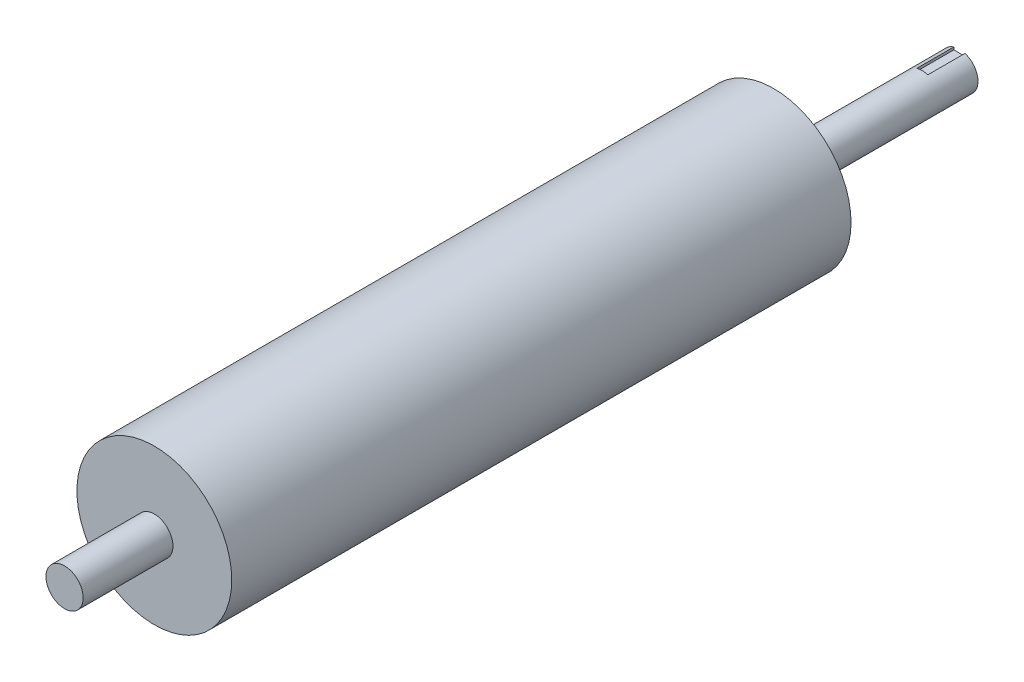
ISO-10303-21;
HEADER;
FILE_DESCRIPTION(('STEP AP214'),'2;1');
FILE_NAME('part.step','',(''),(''),'','','');
FILE_SCHEMA(('AUTOMOTIVE_DESIGN { 1 0 10303 214 1 1 1 1 }'));
ENDSEC;
DATA;
#1=APPLICATION_CONTEXT('core data for automotive mechanical design processes');
#2=APPLICATION_PROTOCOL_DEFINITION('international standard','automotive_design',2000,#1);
#3=PRODUCT_CONTEXT('',#1,'mechanical');
#4=PRODUCT('Part','Part','',(#3));
#5=PRODUCT_RELATED_PRODUCT_CATEGORY('part','',(#4));
#6=PRODUCT_DEFINITION_FORMATION('','',#4);
#7=PRODUCT_DEFINITION_CONTEXT('part definition',#1,'design');
#8=PRODUCT_DEFINITION('design','',#6,#7);
#9=PRODUCT_DEFINITION_SHAPE('','',#8);
#10=(LENGTH_UNIT() NAMED_UNIT(*) SI_UNIT(.MILLI.,.METRE.));
#11=(NAMED_UNIT(*) PLANE_ANGLE_UNIT() SI_UNIT($,.RADIAN.));
#12=(NAMED_UNIT(*) SI_UNIT($,.STERADIAN.) SOLID_ANGLE_UNIT());
#13=UNCERTAINTY_MEASURE_WITH_UNIT(LENGTH_MEASURE(1.E-05),#10,'distance_accuracy_value','');
#14=(GEOMETRIC_REPRESENTATION_CONTEXT(3) GLOBAL_UNCERTAINTY_ASSIGNED_CONTEXT((#13)) GLOBAL_UNIT_ASSIGNED_CONTEXT((#10,
#11,#12)) REPRESENTATION_CONTEXT('',''));
#15=CARTESIAN_POINT('',(0.,0.,0.));
#16=DIRECTION('',(0.,0.,1.));
#17=DIRECTION('',(1.,0.,0.));
#18=AXIS2_PLACEMENT_3D('',#15,#16,#17);
#19=CARTESIAN_POINT('',(0.,0.,-300.));
#20=DIRECTION('',(0.,0.,1.));
#21=DIRECTION('',(1.,0.,0.));
#22=AXIS2_PLACEMENT_3D('',#19,#20,#21);
#23=CYLINDRICAL_SURFACE('',#22,30.);
#24=CARTESIAN_POINT('',(0.,0.,0.));
#25=DIRECTION('',(0.,0.,-1.));
#26=DIRECTION('',(-1.,0.,0.));
#27=AXIS2_PLACEMENT_3D('',#24,#25,#26);
#28=CIRCLE('',#27,30.);
#29=CARTESIAN_POINT('',(-30.,0.,0.));
#30=VERTEX_POINT('',#29);
#31=EDGE_CURVE('E62',#30,#30,#28,.T.);
#32=ORIENTED_EDGE('',*,*,#31,.T.);
#33=EDGE_LOOP('',(#32));
#34=FACE_BOUND('',#33,.T.);
#35=DIRECTION('',(0.,0.,1.));
#36=VECTOR('',#35,1.);
#37=CARTESIAN_POINT('',(9.,28.6181760425084,-300.));
#38=LINE('',#37,#36);
#39=CARTESIAN_POINT('',(9.,28.6181760425084,-240.));
#40=VERTEX_POINT('',#39);
#41=CARTESIAN_POINT('',(9.,28.6181760425084,-300.));
#42=VERTEX_POINT('',#41);
#43=EDGE_CURVE('E130',#40,#42,#38,.F.);
#44=ORIENTED_EDGE('',*,*,#43,.F.);
#45=CARTESIAN_POINT('',(0.,0.,-240.));
#46=DIRECTION('',(0.,0.,1.));
#47=DIRECTION('',(1.,0.,0.));
#48=AXIS2_PLACEMENT_3D('',#45,#46,#47);
#49=CIRCLE('',#48,30.);
#50=CARTESIAN_POINT('',(-9.,28.6181760425084,-240.));
#51=VERTEX_POINT('',#50);
#52=EDGE_CURVE('E11',#40,#51,#49,.T.);
#53=ORIENTED_EDGE('',*,*,#52,.T.);
#54=DIRECTION('',(0.,0.,1.));
#55=VECTOR('',#54,1.);
#56=CARTESIAN_POINT('',(-9.,28.6181760425084,-300.));
#57=LINE('',#56,#55);
#58=CARTESIAN_POINT('',(-9.,28.6181760425084,-300.));
#59=VERTEX_POINT('',#58);
#60=EDGE_CURVE('E105',#51,#59,#57,.F.);
#61=ORIENTED_EDGE('',*,*,#60,.T.);
#62=CARTESIAN_POINT('',(0.,0.,-300.));
#63=DIRECTION('',(0.,0.,-1.));
#64=DIRECTION('',(-1.,0.,0.));
#65=AXIS2_PLACEMENT_3D('',#62,#63,#64);
#66=CIRCLE('',#65,30.);
#67=EDGE_CURVE('E133',#42,#59,#66,.T.);
#68=ORIENTED_EDGE('',*,*,#67,.F.);
#69=EDGE_LOOP('',(#44,#53,#61,#68));
#70=FACE_BOUND('',#69,.T.);
#71=ADVANCED_FACE('F53',(#34,#70),#23,.T.);
#72=CARTESIAN_POINT('',(0.,0.,-300.));
#73=DIRECTION('',(0.,0.,-1.));
#74=DIRECTION('',(-1.,0.,0.));
#75=AXIS2_PLACEMENT_3D('',#72,#73,#74);
#76=PLANE('',#75);
#77=DIRECTION('',(-1.,0.,0.));
#78=VECTOR('',#77,1.);
#79=CARTESIAN_POINT('',(9.,24.5,-300.));
#80=LINE('',#79,#78);
#81=CARTESIAN_POINT('',(9.,24.5,-300.));
#82=VERTEX_POINT('',#81);
#83=CARTESIAN_POINT('',(-9.,24.5,-300.));
#84=VERTEX_POINT('',#83);
#85=EDGE_CURVE('E101',#82,#84,#80,.T.);
#86=ORIENTED_EDGE('',*,*,#85,.F.);
#87=DIRECTION('',(0.,1.,0.));
#88=VECTOR('',#87,1.);
#89=CARTESIAN_POINT('',(9.,24.5,-300.));
#90=LINE('',#89,#88);
#91=EDGE_CURVE('E69',#82,#42,#90,.T.);
#92=ORIENTED_EDGE('',*,*,#91,.T.);
#93=ORIENTED_EDGE('',*,*,#67,.T.);
#94=DIRECTION('',(0.,1.,0.));
#95=VECTOR('',#94,1.);
#96=CARTESIAN_POINT('',(-9.,24.5,-300.));
#97=LINE('',#96,#95);
#98=EDGE_CURVE('E123',#84,#59,#97,.T.);
#99=ORIENTED_EDGE('',*,*,#98,.F.);
#100=EDGE_LOOP('',(#86,#92,#93,#99));
#101=FACE_BOUND('',#100,.T.);
#102=ADVANCED_FACE('F173',(#101),#76,.T.);
#103=CARTESIAN_POINT('',(0.,0.,1000.));
#104=DIRECTION('',(0.,0.,-1.));
#105=DIRECTION('',(-1.,0.,0.));
#106=AXIS2_PLACEMENT_3D('',#103,#104,#105);
#107=CYLINDRICAL_SURFACE('',#106,125.);
#108=CARTESIAN_POINT('',(0.,0.,1000.));
#109=DIRECTION('',(0.,0.,1.));
#110=DIRECTION('',(1.,0.,0.));
#111=AXIS2_PLACEMENT_3D('',#108,#109,#110);
#112=CIRCLE('',#111,125.);
#113=CARTESIAN_POINT('',(125.,0.,1000.));
#114=VERTEX_POINT('',#113);
#115=EDGE_CURVE('E149',#114,#114,#112,.T.);
#116=ORIENTED_EDGE('',*,*,#115,.F.);
#117=EDGE_LOOP('',(#116));
#118=FACE_BOUND('',#117,.T.);
#119=CARTESIAN_POINT('',(0.,0.,0.));
#120=DIRECTION('',(0.,0.,1.));
#121=DIRECTION('',(1.,0.,0.));
#122=AXIS2_PLACEMENT_3D('',#119,#120,#121);
#123=CIRCLE('',#122,125.);
#124=CARTESIAN_POINT('',(125.,0.,0.));
#125=VERTEX_POINT('',#124);
#126=EDGE_CURVE('E145',#125,#125,#123,.T.);
#127=ORIENTED_EDGE('',*,*,#126,.T.);
#128=EDGE_LOOP('',(#127));
#129=FACE_BOUND('',#128,.T.);
#130=ADVANCED_FACE('F55',(#118,#129),#107,.T.);
#131=CARTESIAN_POINT('',(0.,0.,1000.));
#132=DIRECTION('',(0.,0.,1.));
#133=DIRECTION('',(1.,0.,0.));
#134=AXIS2_PLACEMENT_3D('',#131,#132,#133);
#135=PLANE('',#134);
#136=CARTESIAN_POINT('',(0.,0.,1000.));
#137=DIRECTION('',(0.,0.,1.));
#138=DIRECTION('',(1.,0.,0.));
#139=AXIS2_PLACEMENT_3D('',#136,#137,#138);
#140=CIRCLE('',#139,30.);
#141=CARTESIAN_POINT('',(30.,0.,1000.));
#142=VERTEX_POINT('',#141);
#143=EDGE_CURVE('E141',#142,#142,#140,.T.);
#144=ORIENTED_EDGE('',*,*,#143,.F.);
#145=EDGE_LOOP('',(#144));
#146=FACE_BOUND('',#145,.T.);
#147=ORIENTED_EDGE('',*,*,#115,.T.);
#148=EDGE_LOOP('',(#147));
#149=FACE_BOUND('',#148,.T.);
#150=ADVANCED_FACE('F160',(#146,#149),#135,.T.);
#151=CARTESIAN_POINT('',(0.,0.,0.));
#152=DIRECTION('',(0.,0.,1.));
#153=DIRECTION('',(1.,0.,0.));
#154=AXIS2_PLACEMENT_3D('',#151,#152,#153);
#155=PLANE('',#154);
#156=ORIENTED_EDGE('',*,*,#31,.F.);
#157=EDGE_LOOP('',(#156));
#158=FACE_BOUND('',#157,.T.);
#159=ORIENTED_EDGE('',*,*,#126,.F.);
#160=EDGE_LOOP('',(#159));
#161=FACE_BOUND('',#160,.T.);
#162=ADVANCED_FACE('F157',(#158,#161),#155,.F.);
#163=CARTESIAN_POINT('',(0.,0.,1145.));
#164=DIRECTION('',(0.,0.,-1.));
#165=DIRECTION('',(-1.,0.,0.));
#166=AXIS2_PLACEMENT_3D('',#163,#164,#165);
#167=CYLINDRICAL_SURFACE('',#166,30.);
#168=CARTESIAN_POINT('',(0.,0.,1145.));
#169=DIRECTION('',(0.,0.,1.));
#170=DIRECTION('',(1.,0.,0.));
#171=AXIS2_PLACEMENT_3D('',#168,#169,#170);
#172=CIRCLE('',#171,30.);
#173=CARTESIAN_POINT('',(30.,0.,1145.));
#174=VERTEX_POINT('',#173);
#175=EDGE_CURVE('E137',#174,#174,#172,.T.);
#176=ORIENTED_EDGE('',*,*,#175,.F.);
#177=EDGE_LOOP('',(#176));
#178=FACE_BOUND('',#177,.T.);
#179=ORIENTED_EDGE('',*,*,#143,.T.);
#180=EDGE_LOOP('',(#179));
#181=FACE_BOUND('',#180,.T.);
#182=ADVANCED_FACE('F159',(#178,#181),#167,.T.);
#183=CARTESIAN_POINT('',(0.,0.,1145.));
#184=DIRECTION('',(0.,0.,1.));
#185=DIRECTION('',(1.,0.,0.));
#186=AXIS2_PLACEMENT_3D('',#183,#184,#185);
#187=PLANE('',#186);
#188=ORIENTED_EDGE('',*,*,#175,.T.);
#189=EDGE_LOOP('',(#188));
#190=FACE_BOUND('',#189,.T.);
#191=ADVANCED_FACE('F166',(#190),#187,.T.);
#192=CARTESIAN_POINT('',(0.,0.,-240.));
#193=DIRECTION('',(0.,0.,1.));
#194=DIRECTION('',(1.,0.,0.));
#195=AXIS2_PLACEMENT_3D('',#192,#193,#194);
#196=PLANE('',#195);
#197=DIRECTION('',(0.,1.,0.));
#198=VECTOR('',#197,1.);
#199=CARTESIAN_POINT('',(9.,24.5,-240.));
#200=LINE('',#199,#198);
#201=CARTESIAN_POINT('',(9.,24.5,-240.));
#202=VERTEX_POINT('',#201);
#203=EDGE_CURVE('E112',#202,#40,#200,.T.);
#204=ORIENTED_EDGE('',*,*,#203,.F.);
#205=DIRECTION('',(-1.,0.,0.));
#206=VECTOR('',#205,1.);
#207=CARTESIAN_POINT('',(9.,24.5,-240.));
#208=LINE('',#207,#206);
#209=CARTESIAN_POINT('',(-9.,24.5,-240.));
#210=VERTEX_POINT('',#209);
#211=EDGE_CURVE('E99',#202,#210,#208,.T.);
#212=ORIENTED_EDGE('',*,*,#211,.T.);
#213=DIRECTION('',(0.,1.,0.));
#214=VECTOR('',#213,1.);
#215=CARTESIAN_POINT('',(-9.,24.5,-240.));
#216=LINE('',#215,#214);
#217=EDGE_CURVE('E108',#210,#51,#216,.T.);
#218=ORIENTED_EDGE('',*,*,#217,.T.);
#219=ORIENTED_EDGE('',*,*,#52,.F.);
#220=EDGE_LOOP('',(#204,#212,#218,#219));
#221=FACE_BOUND('',#220,.T.);
#222=ADVANCED_FACE('F114',(#221),#196,.F.);
#223=CARTESIAN_POINT('',(9.,24.5,-240.));
#224=DIRECTION('',(-1.,0.,0.));
#225=DIRECTION('',(0.,0.,1.));
#226=AXIS2_PLACEMENT_3D('',#223,#224,#225);
#227=PLANE('',#226);
#228=ORIENTED_EDGE('',*,*,#43,.T.);
#229=ORIENTED_EDGE('',*,*,#91,.F.);
#230=DIRECTION('',(0.,0.,-1.));
#231=VECTOR('',#230,1.);
#232=CARTESIAN_POINT('',(9.,24.5,-240.));
#233=LINE('',#232,#231);
#234=EDGE_CURVE('E106',#202,#82,#233,.T.);
#235=ORIENTED_EDGE('',*,*,#234,.F.);
#236=ORIENTED_EDGE('',*,*,#203,.T.);
#237=EDGE_LOOP('',(#228,#229,#235,#236));
#238=FACE_BOUND('',#237,.T.);
#239=ADVANCED_FACE('F189',(#238),#227,.T.);
#240=CARTESIAN_POINT('',(-9.,24.5,-240.));
#241=DIRECTION('',(-1.,0.,0.));
#242=DIRECTION('',(0.,0.,1.));
#243=AXIS2_PLACEMENT_3D('',#240,#241,#242);
#244=PLANE('',#243);
#245=ORIENTED_EDGE('',*,*,#217,.F.);
#246=DIRECTION('',(0.,0.,-1.));
#247=VECTOR('',#246,1.);
#248=CARTESIAN_POINT('',(-9.,24.5,-240.));
#249=LINE('',#248,#247);
#250=EDGE_CURVE('E95',#210,#84,#249,.T.);
#251=ORIENTED_EDGE('',*,*,#250,.T.);
#252=ORIENTED_EDGE('',*,*,#98,.T.);
#253=ORIENTED_EDGE('',*,*,#60,.F.);
#254=EDGE_LOOP('',(#245,#251,#252,#253));
#255=FACE_BOUND('',#254,.T.);
#256=ADVANCED_FACE('F109',(#255),#244,.F.);
#257=CARTESIAN_POINT('',(9.,24.5,-240.));
#258=DIRECTION('',(0.,-1.,0.));
#259=DIRECTION('',(0.,0.,-1.));
#260=AXIS2_PLACEMENT_3D('',#257,#258,#259);
#261=PLANE('',#260);
#262=ORIENTED_EDGE('',*,*,#85,.T.);
#263=ORIENTED_EDGE('',*,*,#250,.F.);
#264=ORIENTED_EDGE('',*,*,#211,.F.);
#265=ORIENTED_EDGE('',*,*,#234,.T.);
#266=EDGE_LOOP('',(#262,#263,#264,#265));
#267=FACE_BOUND('',#266,.T.);
#268=ADVANCED_FACE('F97',(#267),#261,.F.);
#269=CLOSED_SHELL('',(#71,#102,#130,#150,#162,#182,#191,#222,#239,#256,#268));
#270=MANIFOLD_SOLID_BREP('B2',#269);
#271=ADVANCED_BREP_SHAPE_REPRESENTATION('',(#18,#270),#14);
#272=SHAPE_DEFINITION_REPRESENTATION(#9,#271);
ENDSEC;
END-ISO-10303-21;
